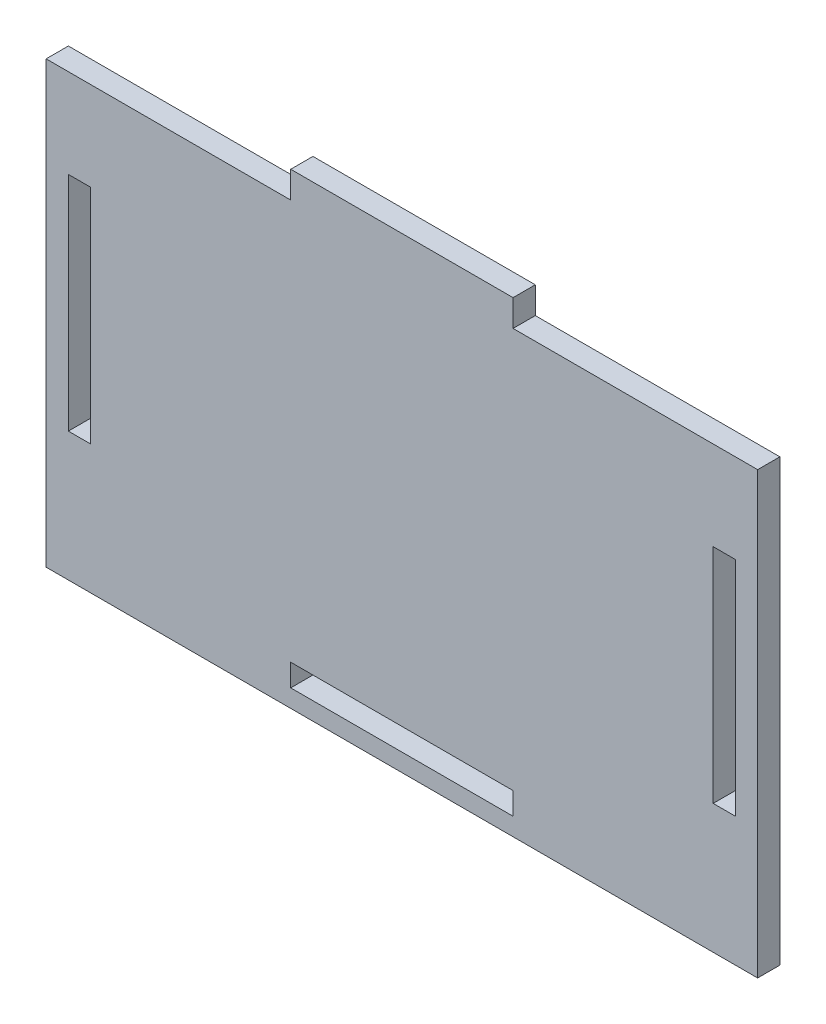
ISO-10303-21;
HEADER;
FILE_DESCRIPTION(('STEP AP214'),'2;1');
FILE_NAME('part.step','',(''),(''),'','','');
FILE_SCHEMA(('AUTOMOTIVE_DESIGN { 1 0 10303 214 1 1 1 1 }'));
ENDSEC;
DATA;
#1=APPLICATION_CONTEXT('core data for automotive mechanical design processes');
#2=APPLICATION_PROTOCOL_DEFINITION('international standard','automotive_design',2000,#1);
#3=PRODUCT_CONTEXT('',#1,'mechanical');
#4=PRODUCT('Part','Part','',(#3));
#5=PRODUCT_RELATED_PRODUCT_CATEGORY('part','',(#4));
#6=PRODUCT_DEFINITION_FORMATION('','',#4);
#7=PRODUCT_DEFINITION_CONTEXT('part definition',#1,'design');
#8=PRODUCT_DEFINITION('design','',#6,#7);
#9=PRODUCT_DEFINITION_SHAPE('','',#8);
#10=(LENGTH_UNIT() NAMED_UNIT(*) SI_UNIT(.MILLI.,.METRE.));
#11=(NAMED_UNIT(*) PLANE_ANGLE_UNIT() SI_UNIT($,.RADIAN.));
#12=(NAMED_UNIT(*) SI_UNIT($,.STERADIAN.) SOLID_ANGLE_UNIT());
#13=UNCERTAINTY_MEASURE_WITH_UNIT(LENGTH_MEASURE(1.E-05),#10,'distance_accuracy_value','');
#14=(GEOMETRIC_REPRESENTATION_CONTEXT(3) GLOBAL_UNCERTAINTY_ASSIGNED_CONTEXT((#13)) GLOBAL_UNIT_ASSIGNED_CONTEXT((#10,
#11,#12)) REPRESENTATION_CONTEXT('',''));
#15=CARTESIAN_POINT('',(0.,0.,0.));
#16=DIRECTION('',(0.,0.,1.));
#17=DIRECTION('',(1.,0.,0.));
#18=AXIS2_PLACEMENT_3D('',#15,#16,#17);
#19=CARTESIAN_POINT('',(0.,0.,3.175));
#20=DIRECTION('',(0.,0.,1.));
#21=DIRECTION('',(1.,0.,0.));
#22=AXIS2_PLACEMENT_3D('',#19,#20,#21);
#23=PLANE('',#22);
#24=DIRECTION('',(1.,0.,0.));
#25=VECTOR('',#24,1.);
#26=CARTESIAN_POINT('',(-47.625,-15.875,3.175));
#27=LINE('',#26,#25);
#28=CARTESIAN_POINT('',(-47.625,-15.875,3.175));
#29=VERTEX_POINT('',#28);
#30=CARTESIAN_POINT('',(-44.45,-15.875,3.175));
#31=VERTEX_POINT('',#30);
#32=EDGE_CURVE('E208',#29,#31,#27,.T.);
#33=ORIENTED_EDGE('',*,*,#32,.F.);
#34=DIRECTION('',(0.,-1.,0.));
#35=VECTOR('',#34,1.);
#36=CARTESIAN_POINT('',(-47.625,15.875,3.175));
#37=LINE('',#36,#35);
#38=CARTESIAN_POINT('',(-47.625,15.875,3.175));
#39=VERTEX_POINT('',#38);
#40=EDGE_CURVE('E206',#39,#29,#37,.T.);
#41=ORIENTED_EDGE('',*,*,#40,.F.);
#42=DIRECTION('',(-1.,0.,0.));
#43=VECTOR('',#42,1.);
#44=CARTESIAN_POINT('',(-47.625,15.875,3.175));
#45=LINE('',#44,#43);
#46=CARTESIAN_POINT('',(-44.45,15.875,3.175));
#47=VERTEX_POINT('',#46);
#48=EDGE_CURVE('E214',#47,#39,#45,.T.);
#49=ORIENTED_EDGE('',*,*,#48,.F.);
#50=DIRECTION('',(0.,1.,0.));
#51=VECTOR('',#50,1.);
#52=CARTESIAN_POINT('',(-44.45,15.875,3.175));
#53=LINE('',#52,#51);
#54=EDGE_CURVE('E211',#31,#47,#53,.T.);
#55=ORIENTED_EDGE('',*,*,#54,.F.);
#56=EDGE_LOOP('',(#33,#41,#49,#55));
#57=FACE_BOUND('',#56,.T.);
#58=DIRECTION('',(0.,-1.,0.));
#59=VECTOR('',#58,1.);
#60=CARTESIAN_POINT('',(-50.8,28.575,3.175));
#61=LINE('',#60,#59);
#62=CARTESIAN_POINT('',(-50.8,28.575,3.175));
#63=VERTEX_POINT('',#62);
#64=CARTESIAN_POINT('',(-50.8,-34.29,3.175));
#65=VERTEX_POINT('',#64);
#66=EDGE_CURVE('E268',#63,#65,#61,.T.);
#67=ORIENTED_EDGE('',*,*,#66,.T.);
#68=DIRECTION('',(1.,0.,0.));
#69=VECTOR('',#68,1.);
#70=CARTESIAN_POINT('',(-50.8,-34.29,3.175));
#71=LINE('',#70,#69);
#72=CARTESIAN_POINT('',(50.8,-34.29,3.175));
#73=VERTEX_POINT('',#72);
#74=EDGE_CURVE('E271',#65,#73,#71,.T.);
#75=ORIENTED_EDGE('',*,*,#74,.T.);
#76=DIRECTION('',(0.,1.,0.));
#77=VECTOR('',#76,1.);
#78=CARTESIAN_POINT('',(50.8,28.575,3.175));
#79=LINE('',#78,#77);
#80=CARTESIAN_POINT('',(50.8,28.575,3.175));
#81=VERTEX_POINT('',#80);
#82=EDGE_CURVE('E274',#73,#81,#79,.T.);
#83=ORIENTED_EDGE('',*,*,#82,.T.);
#84=DIRECTION('',(-1.,0.,0.));
#85=VECTOR('',#84,1.);
#86=CARTESIAN_POINT('',(15.875,28.575,3.175));
#87=LINE('',#86,#85);
#88=CARTESIAN_POINT('',(15.875,28.575,3.175));
#89=VERTEX_POINT('',#88);
#90=EDGE_CURVE('E276',#81,#89,#87,.T.);
#91=ORIENTED_EDGE('',*,*,#90,.T.);
#92=DIRECTION('',(0.,1.,0.));
#93=VECTOR('',#92,1.);
#94=CARTESIAN_POINT('',(15.875,28.575,3.175));
#95=LINE('',#94,#93);
#96=CARTESIAN_POINT('',(15.875,32.385,3.175));
#97=VERTEX_POINT('',#96);
#98=EDGE_CURVE('E278',#89,#97,#95,.T.);
#99=ORIENTED_EDGE('',*,*,#98,.T.);
#100=DIRECTION('',(-1.,0.,0.));
#101=VECTOR('',#100,1.);
#102=CARTESIAN_POINT('',(-15.875,32.385,3.175));
#103=LINE('',#102,#101);
#104=CARTESIAN_POINT('',(-15.875,32.385,3.175));
#105=VERTEX_POINT('',#104);
#106=EDGE_CURVE('E280',#97,#105,#103,.T.);
#107=ORIENTED_EDGE('',*,*,#106,.T.);
#108=DIRECTION('',(0.,-1.,0.));
#109=VECTOR('',#108,1.);
#110=CARTESIAN_POINT('',(-15.875,28.575,3.175));
#111=LINE('',#110,#109);
#112=CARTESIAN_POINT('',(-15.875,28.575,3.175));
#113=VERTEX_POINT('',#112);
#114=EDGE_CURVE('E282',#105,#113,#111,.T.);
#115=ORIENTED_EDGE('',*,*,#114,.T.);
#116=DIRECTION('',(-1.,0.,0.));
#117=VECTOR('',#116,1.);
#118=CARTESIAN_POINT('',(-50.8,28.575,3.175));
#119=LINE('',#118,#117);
#120=EDGE_CURVE('E284',#113,#63,#119,.T.);
#121=ORIENTED_EDGE('',*,*,#120,.T.);
#122=EDGE_LOOP('',(#67,#75,#83,#91,#99,#107,#115,#121));
#123=FACE_BOUND('',#122,.T.);
#124=DIRECTION('',(1.,0.,0.));
#125=VECTOR('',#124,1.);
#126=CARTESIAN_POINT('',(-15.875,-31.75,3.175));
#127=LINE('',#126,#125);
#128=CARTESIAN_POINT('',(-15.875,-31.75,3.175));
#129=VERTEX_POINT('',#128);
#130=CARTESIAN_POINT('',(15.875,-31.75,3.175));
#131=VERTEX_POINT('',#130);
#132=EDGE_CURVE('E239',#129,#131,#127,.T.);
#133=ORIENTED_EDGE('',*,*,#132,.F.);
#134=DIRECTION('',(0.,-1.,0.));
#135=VECTOR('',#134,1.);
#136=CARTESIAN_POINT('',(-15.875,-28.575,3.175));
#137=LINE('',#136,#135);
#138=CARTESIAN_POINT('',(-15.875,-28.575,3.175));
#139=VERTEX_POINT('',#138);
#140=EDGE_CURVE('E237',#139,#129,#137,.T.);
#141=ORIENTED_EDGE('',*,*,#140,.F.);
#142=DIRECTION('',(-1.,0.,0.));
#143=VECTOR('',#142,1.);
#144=CARTESIAN_POINT('',(-15.875,-28.575,3.175));
#145=LINE('',#144,#143);
#146=CARTESIAN_POINT('',(15.875,-28.575,3.175));
#147=VERTEX_POINT('',#146);
#148=EDGE_CURVE('E245',#147,#139,#145,.T.);
#149=ORIENTED_EDGE('',*,*,#148,.F.);
#150=DIRECTION('',(0.,1.,0.));
#151=VECTOR('',#150,1.);
#152=CARTESIAN_POINT('',(15.875,-28.575,3.175));
#153=LINE('',#152,#151);
#154=EDGE_CURVE('E242',#131,#147,#153,.T.);
#155=ORIENTED_EDGE('',*,*,#154,.F.);
#156=EDGE_LOOP('',(#133,#141,#149,#155));
#157=FACE_BOUND('',#156,.T.);
#158=DIRECTION('',(1.,0.,0.));
#159=VECTOR('',#158,1.);
#160=CARTESIAN_POINT('',(44.45,-15.875,3.175));
#161=LINE('',#160,#159);
#162=CARTESIAN_POINT('',(44.45,-15.875,3.175));
#163=VERTEX_POINT('',#162);
#164=CARTESIAN_POINT('',(47.625,-15.875,3.175));
#165=VERTEX_POINT('',#164);
#166=EDGE_CURVE('E178',#163,#165,#161,.T.);
#167=ORIENTED_EDGE('',*,*,#166,.F.);
#168=DIRECTION('',(0.,-1.,0.));
#169=VECTOR('',#168,1.);
#170=CARTESIAN_POINT('',(44.45,15.875,3.175));
#171=LINE('',#170,#169);
#172=CARTESIAN_POINT('',(44.45,15.875,3.175));
#173=VERTEX_POINT('',#172);
#174=EDGE_CURVE('E170',#173,#163,#171,.T.);
#175=ORIENTED_EDGE('',*,*,#174,.F.);
#176=DIRECTION('',(-1.,0.,0.));
#177=VECTOR('',#176,1.);
#178=CARTESIAN_POINT('',(44.45,15.875,3.175));
#179=LINE('',#178,#177);
#180=CARTESIAN_POINT('',(47.625,15.875,3.175));
#181=VERTEX_POINT('',#180);
#182=EDGE_CURVE('E192',#181,#173,#179,.T.);
#183=ORIENTED_EDGE('',*,*,#182,.F.);
#184=DIRECTION('',(0.,1.,0.));
#185=VECTOR('',#184,1.);
#186=CARTESIAN_POINT('',(47.625,15.875,3.175));
#187=LINE('',#186,#185);
#188=EDGE_CURVE('E190',#165,#181,#187,.T.);
#189=ORIENTED_EDGE('',*,*,#188,.F.);
#190=EDGE_LOOP('',(#167,#175,#183,#189));
#191=FACE_BOUND('',#190,.T.);
#192=ADVANCED_FACE('F33',(#57,#123,#157,#191),#23,.T.);
#193=CARTESIAN_POINT('',(0.,0.,0.));
#194=DIRECTION('',(0.,0.,1.));
#195=DIRECTION('',(1.,0.,0.));
#196=AXIS2_PLACEMENT_3D('',#193,#194,#195);
#197=PLANE('',#196);
#198=DIRECTION('',(0.,-1.,0.));
#199=VECTOR('',#198,1.);
#200=CARTESIAN_POINT('',(-47.625,15.875,0.));
#201=LINE('',#200,#199);
#202=CARTESIAN_POINT('',(-47.625,15.875,0.));
#203=VERTEX_POINT('',#202);
#204=CARTESIAN_POINT('',(-47.625,-15.875,0.));
#205=VERTEX_POINT('',#204);
#206=EDGE_CURVE('E186',#203,#205,#201,.T.);
#207=ORIENTED_EDGE('',*,*,#206,.T.);
#208=DIRECTION('',(1.,0.,0.));
#209=VECTOR('',#208,1.);
#210=CARTESIAN_POINT('',(-47.625,-15.875,0.));
#211=LINE('',#210,#209);
#212=CARTESIAN_POINT('',(-44.45,-15.875,0.));
#213=VERTEX_POINT('',#212);
#214=EDGE_CURVE('E219',#205,#213,#211,.T.);
#215=ORIENTED_EDGE('',*,*,#214,.T.);
#216=DIRECTION('',(0.,1.,0.));
#217=VECTOR('',#216,1.);
#218=CARTESIAN_POINT('',(-44.45,15.875,0.));
#219=LINE('',#218,#217);
#220=CARTESIAN_POINT('',(-44.45,15.875,0.));
#221=VERTEX_POINT('',#220);
#222=EDGE_CURVE('E222',#213,#221,#219,.T.);
#223=ORIENTED_EDGE('',*,*,#222,.T.);
#224=DIRECTION('',(-1.,0.,0.));
#225=VECTOR('',#224,1.);
#226=CARTESIAN_POINT('',(-47.625,15.875,0.));
#227=LINE('',#226,#225);
#228=EDGE_CURVE('E209',#221,#203,#227,.T.);
#229=ORIENTED_EDGE('',*,*,#228,.T.);
#230=EDGE_LOOP('',(#207,#215,#223,#229));
#231=FACE_BOUND('',#230,.T.);
#232=DIRECTION('',(0.,-1.,0.));
#233=VECTOR('',#232,1.);
#234=CARTESIAN_POINT('',(-50.8,28.575,0.));
#235=LINE('',#234,#233);
#236=CARTESIAN_POINT('',(-50.8,28.575,0.));
#237=VERTEX_POINT('',#236);
#238=CARTESIAN_POINT('',(-50.8,-34.29,0.));
#239=VERTEX_POINT('',#238);
#240=EDGE_CURVE('E267',#237,#239,#235,.T.);
#241=ORIENTED_EDGE('',*,*,#240,.F.);
#242=DIRECTION('',(-1.,0.,0.));
#243=VECTOR('',#242,1.);
#244=CARTESIAN_POINT('',(-50.8,28.575,0.));
#245=LINE('',#244,#243);
#246=CARTESIAN_POINT('',(-15.875,28.575,0.));
#247=VERTEX_POINT('',#246);
#248=EDGE_CURVE('E272',#247,#237,#245,.T.);
#249=ORIENTED_EDGE('',*,*,#248,.F.);
#250=DIRECTION('',(0.,-1.,0.));
#251=VECTOR('',#250,1.);
#252=CARTESIAN_POINT('',(-15.875,28.575,0.));
#253=LINE('',#252,#251);
#254=CARTESIAN_POINT('',(-15.875,32.385,0.));
#255=VERTEX_POINT('',#254);
#256=EDGE_CURVE('E299',#255,#247,#253,.T.);
#257=ORIENTED_EDGE('',*,*,#256,.F.);
#258=DIRECTION('',(-1.,0.,0.));
#259=VECTOR('',#258,1.);
#260=CARTESIAN_POINT('',(-15.875,32.385,0.));
#261=LINE('',#260,#259);
#262=CARTESIAN_POINT('',(15.875,32.385,0.));
#263=VERTEX_POINT('',#262);
#264=EDGE_CURVE('E297',#263,#255,#261,.T.);
#265=ORIENTED_EDGE('',*,*,#264,.F.);
#266=DIRECTION('',(0.,1.,0.));
#267=VECTOR('',#266,1.);
#268=CARTESIAN_POINT('',(15.875,28.575,0.));
#269=LINE('',#268,#267);
#270=CARTESIAN_POINT('',(15.875,28.575,0.));
#271=VERTEX_POINT('',#270);
#272=EDGE_CURVE('E295',#271,#263,#269,.T.);
#273=ORIENTED_EDGE('',*,*,#272,.F.);
#274=DIRECTION('',(-1.,0.,0.));
#275=VECTOR('',#274,1.);
#276=CARTESIAN_POINT('',(15.875,28.575,0.));
#277=LINE('',#276,#275);
#278=CARTESIAN_POINT('',(50.8,28.575,0.));
#279=VERTEX_POINT('',#278);
#280=EDGE_CURVE('E293',#279,#271,#277,.T.);
#281=ORIENTED_EDGE('',*,*,#280,.F.);
#282=DIRECTION('',(0.,1.,0.));
#283=VECTOR('',#282,1.);
#284=CARTESIAN_POINT('',(50.8,28.575,0.));
#285=LINE('',#284,#283);
#286=CARTESIAN_POINT('',(50.8,-34.29,0.));
#287=VERTEX_POINT('',#286);
#288=EDGE_CURVE('E291',#287,#279,#285,.T.);
#289=ORIENTED_EDGE('',*,*,#288,.F.);
#290=DIRECTION('',(1.,0.,0.));
#291=VECTOR('',#290,1.);
#292=CARTESIAN_POINT('',(-50.8,-34.29,0.));
#293=LINE('',#292,#291);
#294=EDGE_CURVE('E289',#239,#287,#293,.T.);
#295=ORIENTED_EDGE('',*,*,#294,.F.);
#296=EDGE_LOOP('',(#241,#249,#257,#265,#273,#281,#289,#295));
#297=FACE_BOUND('',#296,.T.);
#298=DIRECTION('',(0.,-1.,0.));
#299=VECTOR('',#298,1.);
#300=CARTESIAN_POINT('',(-15.875,-28.575,0.));
#301=LINE('',#300,#299);
#302=CARTESIAN_POINT('',(-15.875,-28.575,0.));
#303=VERTEX_POINT('',#302);
#304=CARTESIAN_POINT('',(-15.875,-31.75,0.));
#305=VERTEX_POINT('',#304);
#306=EDGE_CURVE('E236',#303,#305,#301,.T.);
#307=ORIENTED_EDGE('',*,*,#306,.T.);
#308=DIRECTION('',(1.,0.,0.));
#309=VECTOR('',#308,1.);
#310=CARTESIAN_POINT('',(-15.875,-31.75,0.));
#311=LINE('',#310,#309);
#312=CARTESIAN_POINT('',(15.875,-31.75,0.));
#313=VERTEX_POINT('',#312);
#314=EDGE_CURVE('E250',#305,#313,#311,.T.);
#315=ORIENTED_EDGE('',*,*,#314,.T.);
#316=DIRECTION('',(0.,1.,0.));
#317=VECTOR('',#316,1.);
#318=CARTESIAN_POINT('',(15.875,-28.575,0.));
#319=LINE('',#318,#317);
#320=CARTESIAN_POINT('',(15.875,-28.575,0.));
#321=VERTEX_POINT('',#320);
#322=EDGE_CURVE('E253',#313,#321,#319,.T.);
#323=ORIENTED_EDGE('',*,*,#322,.T.);
#324=DIRECTION('',(-1.,0.,0.));
#325=VECTOR('',#324,1.);
#326=CARTESIAN_POINT('',(-15.875,-28.575,0.));
#327=LINE('',#326,#325);
#328=EDGE_CURVE('E240',#321,#303,#327,.T.);
#329=ORIENTED_EDGE('',*,*,#328,.T.);
#330=EDGE_LOOP('',(#307,#315,#323,#329));
#331=FACE_BOUND('',#330,.T.);
#332=DIRECTION('',(0.,-1.,0.));
#333=VECTOR('',#332,1.);
#334=CARTESIAN_POINT('',(44.45,15.875,0.));
#335=LINE('',#334,#333);
#336=CARTESIAN_POINT('',(44.45,15.875,0.));
#337=VERTEX_POINT('',#336);
#338=CARTESIAN_POINT('',(44.45,-15.875,0.));
#339=VERTEX_POINT('',#338);
#340=EDGE_CURVE('E56',#337,#339,#335,.T.);
#341=ORIENTED_EDGE('',*,*,#340,.T.);
#342=DIRECTION('',(1.,0.,0.));
#343=VECTOR('',#342,1.);
#344=CARTESIAN_POINT('',(44.45,-15.875,0.));
#345=LINE('',#344,#343);
#346=CARTESIAN_POINT('',(47.625,-15.875,0.));
#347=VERTEX_POINT('',#346);
#348=EDGE_CURVE('E185',#339,#347,#345,.T.);
#349=ORIENTED_EDGE('',*,*,#348,.T.);
#350=DIRECTION('',(0.,1.,0.));
#351=VECTOR('',#350,1.);
#352=CARTESIAN_POINT('',(47.625,15.875,0.));
#353=LINE('',#352,#351);
#354=CARTESIAN_POINT('',(47.625,15.875,0.));
#355=VERTEX_POINT('',#354);
#356=EDGE_CURVE('E198',#347,#355,#353,.T.);
#357=ORIENTED_EDGE('',*,*,#356,.T.);
#358=DIRECTION('',(-1.,0.,0.));
#359=VECTOR('',#358,1.);
#360=CARTESIAN_POINT('',(44.45,15.875,0.));
#361=LINE('',#360,#359);
#362=EDGE_CURVE('E179',#355,#337,#361,.T.);
#363=ORIENTED_EDGE('',*,*,#362,.T.);
#364=EDGE_LOOP('',(#341,#349,#357,#363));
#365=FACE_BOUND('',#364,.T.);
#366=ADVANCED_FACE('F329',(#231,#297,#331,#365),#197,.F.);
#367=CARTESIAN_POINT('',(-50.8,28.575,3.175));
#368=DIRECTION('',(1.,0.,0.));
#369=DIRECTION('',(0.,0.,-1.));
#370=AXIS2_PLACEMENT_3D('',#367,#368,#369);
#371=PLANE('',#370);
#372=ORIENTED_EDGE('',*,*,#240,.T.);
#373=DIRECTION('',(0.,0.,-1.));
#374=VECTOR('',#373,1.);
#375=CARTESIAN_POINT('',(-50.8,-34.29,3.175));
#376=LINE('',#375,#374);
#377=EDGE_CURVE('E11',#65,#239,#376,.T.);
#378=ORIENTED_EDGE('',*,*,#377,.F.);
#379=ORIENTED_EDGE('',*,*,#66,.F.);
#380=DIRECTION('',(0.,0.,-1.));
#381=VECTOR('',#380,1.);
#382=CARTESIAN_POINT('',(-50.8,28.575,3.175));
#383=LINE('',#382,#381);
#384=EDGE_CURVE('E286',#63,#237,#383,.T.);
#385=ORIENTED_EDGE('',*,*,#384,.T.);
#386=EDGE_LOOP('',(#372,#378,#379,#385));
#387=FACE_BOUND('',#386,.T.);
#388=ADVANCED_FACE('F35',(#387),#371,.F.);
#389=CARTESIAN_POINT('',(-50.8,-34.29,3.175));
#390=DIRECTION('',(0.,1.,0.));
#391=DIRECTION('',(-1.,0.,0.));
#392=AXIS2_PLACEMENT_3D('',#389,#390,#391);
#393=PLANE('',#392);
#394=ORIENTED_EDGE('',*,*,#294,.T.);
#395=DIRECTION('',(0.,0.,-1.));
#396=VECTOR('',#395,1.);
#397=CARTESIAN_POINT('',(50.8,-34.29,3.175));
#398=LINE('',#397,#396);
#399=EDGE_CURVE('E41',#73,#287,#398,.T.);
#400=ORIENTED_EDGE('',*,*,#399,.F.);
#401=ORIENTED_EDGE('',*,*,#74,.F.);
#402=ORIENTED_EDGE('',*,*,#377,.T.);
#403=EDGE_LOOP('',(#394,#400,#401,#402));
#404=FACE_BOUND('',#403,.T.);
#405=ADVANCED_FACE('F347',(#404),#393,.F.);
#406=CARTESIAN_POINT('',(50.8,28.575,3.175));
#407=DIRECTION('',(-1.,0.,0.));
#408=DIRECTION('',(0.,0.,1.));
#409=AXIS2_PLACEMENT_3D('',#406,#407,#408);
#410=PLANE('',#409);
#411=ORIENTED_EDGE('',*,*,#288,.T.);
#412=DIRECTION('',(0.,0.,-1.));
#413=VECTOR('',#412,1.);
#414=CARTESIAN_POINT('',(50.8,28.575,3.175));
#415=LINE('',#414,#413);
#416=EDGE_CURVE('E316',#81,#279,#415,.T.);
#417=ORIENTED_EDGE('',*,*,#416,.F.);
#418=ORIENTED_EDGE('',*,*,#82,.F.);
#419=ORIENTED_EDGE('',*,*,#399,.T.);
#420=EDGE_LOOP('',(#411,#417,#418,#419));
#421=FACE_BOUND('',#420,.T.);
#422=ADVANCED_FACE('F323',(#421),#410,.F.);
#423=CARTESIAN_POINT('',(15.875,28.575,3.175));
#424=DIRECTION('',(0.,-1.,0.));
#425=DIRECTION('',(1.,0.,0.));
#426=AXIS2_PLACEMENT_3D('',#423,#424,#425);
#427=PLANE('',#426);
#428=ORIENTED_EDGE('',*,*,#280,.T.);
#429=DIRECTION('',(0.,0.,-1.));
#430=VECTOR('',#429,1.);
#431=CARTESIAN_POINT('',(15.875,28.575,3.175));
#432=LINE('',#431,#430);
#433=EDGE_CURVE('E313',#89,#271,#432,.T.);
#434=ORIENTED_EDGE('',*,*,#433,.F.);
#435=ORIENTED_EDGE('',*,*,#90,.F.);
#436=ORIENTED_EDGE('',*,*,#416,.T.);
#437=EDGE_LOOP('',(#428,#434,#435,#436));
#438=FACE_BOUND('',#437,.T.);
#439=ADVANCED_FACE('F335',(#438),#427,.F.);
#440=CARTESIAN_POINT('',(15.875,28.575,3.175));
#441=DIRECTION('',(-1.,0.,0.));
#442=DIRECTION('',(0.,-1.,0.));
#443=AXIS2_PLACEMENT_3D('',#440,#441,#442);
#444=PLANE('',#443);
#445=ORIENTED_EDGE('',*,*,#272,.T.);
#446=DIRECTION('',(0.,0.,-1.));
#447=VECTOR('',#446,1.);
#448=CARTESIAN_POINT('',(15.875,32.385,3.175));
#449=LINE('',#448,#447);
#450=EDGE_CURVE('E310',#97,#263,#449,.T.);
#451=ORIENTED_EDGE('',*,*,#450,.F.);
#452=ORIENTED_EDGE('',*,*,#98,.F.);
#453=ORIENTED_EDGE('',*,*,#433,.T.);
#454=EDGE_LOOP('',(#445,#451,#452,#453));
#455=FACE_BOUND('',#454,.T.);
#456=ADVANCED_FACE('F339',(#455),#444,.F.);
#457=CARTESIAN_POINT('',(-15.875,32.385,3.175));
#458=DIRECTION('',(0.,-1.,0.));
#459=DIRECTION('',(1.,0.,0.));
#460=AXIS2_PLACEMENT_3D('',#457,#458,#459);
#461=PLANE('',#460);
#462=ORIENTED_EDGE('',*,*,#264,.T.);
#463=DIRECTION('',(0.,0.,-1.));
#464=VECTOR('',#463,1.);
#465=CARTESIAN_POINT('',(-15.875,32.385,3.175));
#466=LINE('',#465,#464);
#467=EDGE_CURVE('E307',#105,#255,#466,.T.);
#468=ORIENTED_EDGE('',*,*,#467,.F.);
#469=ORIENTED_EDGE('',*,*,#106,.F.);
#470=ORIENTED_EDGE('',*,*,#450,.T.);
#471=EDGE_LOOP('',(#462,#468,#469,#470));
#472=FACE_BOUND('',#471,.T.);
#473=ADVANCED_FACE('F360',(#472),#461,.F.);
#474=CARTESIAN_POINT('',(-15.875,28.575,3.175));
#475=DIRECTION('',(1.,0.,0.));
#476=DIRECTION('',(0.,0.,-1.));
#477=AXIS2_PLACEMENT_3D('',#474,#475,#476);
#478=PLANE('',#477);
#479=ORIENTED_EDGE('',*,*,#256,.T.);
#480=DIRECTION('',(0.,0.,-1.));
#481=VECTOR('',#480,1.);
#482=CARTESIAN_POINT('',(-15.875,28.575,3.175));
#483=LINE('',#482,#481);
#484=EDGE_CURVE('E304',#113,#247,#483,.T.);
#485=ORIENTED_EDGE('',*,*,#484,.F.);
#486=ORIENTED_EDGE('',*,*,#114,.F.);
#487=ORIENTED_EDGE('',*,*,#467,.T.);
#488=EDGE_LOOP('',(#479,#485,#486,#487));
#489=FACE_BOUND('',#488,.T.);
#490=ADVANCED_FACE('F358',(#489),#478,.F.);
#491=CARTESIAN_POINT('',(-50.8,28.575,3.175));
#492=DIRECTION('',(0.,-1.,0.));
#493=DIRECTION('',(1.,0.,0.));
#494=AXIS2_PLACEMENT_3D('',#491,#492,#493);
#495=PLANE('',#494);
#496=ORIENTED_EDGE('',*,*,#248,.T.);
#497=ORIENTED_EDGE('',*,*,#384,.F.);
#498=ORIENTED_EDGE('',*,*,#120,.F.);
#499=ORIENTED_EDGE('',*,*,#484,.T.);
#500=EDGE_LOOP('',(#496,#497,#498,#499));
#501=FACE_BOUND('',#500,.T.);
#502=ADVANCED_FACE('F353',(#501),#495,.F.);
#503=CARTESIAN_POINT('',(-15.875,-28.575,3.175));
#504=DIRECTION('',(1.,0.,0.));
#505=DIRECTION('',(0.,0.,-1.));
#506=AXIS2_PLACEMENT_3D('',#503,#504,#505);
#507=PLANE('',#506);
#508=ORIENTED_EDGE('',*,*,#306,.F.);
#509=DIRECTION('',(0.,0.,-1.));
#510=VECTOR('',#509,1.);
#511=CARTESIAN_POINT('',(-15.875,-28.575,3.175));
#512=LINE('',#511,#510);
#513=EDGE_CURVE('E247',#139,#303,#512,.T.);
#514=ORIENTED_EDGE('',*,*,#513,.F.);
#515=ORIENTED_EDGE('',*,*,#140,.T.);
#516=DIRECTION('',(0.,0.,-1.));
#517=VECTOR('',#516,1.);
#518=CARTESIAN_POINT('',(-15.875,-31.75,3.175));
#519=LINE('',#518,#517);
#520=EDGE_CURVE('E264',#129,#305,#519,.T.);
#521=ORIENTED_EDGE('',*,*,#520,.T.);
#522=EDGE_LOOP('',(#508,#514,#515,#521));
#523=FACE_BOUND('',#522,.T.);
#524=ADVANCED_FACE('F379',(#523),#507,.T.);
#525=CARTESIAN_POINT('',(-15.875,-31.75,3.175));
#526=DIRECTION('',(0.,1.,0.));
#527=DIRECTION('',(-1.,0.,0.));
#528=AXIS2_PLACEMENT_3D('',#525,#526,#527);
#529=PLANE('',#528);
#530=ORIENTED_EDGE('',*,*,#314,.F.);
#531=ORIENTED_EDGE('',*,*,#520,.F.);
#532=ORIENTED_EDGE('',*,*,#132,.T.);
#533=DIRECTION('',(0.,0.,-1.));
#534=VECTOR('',#533,1.);
#535=CARTESIAN_POINT('',(15.875,-31.75,3.175));
#536=LINE('',#535,#534);
#537=EDGE_CURVE('E262',#131,#313,#536,.T.);
#538=ORIENTED_EDGE('',*,*,#537,.T.);
#539=EDGE_LOOP('',(#530,#531,#532,#538));
#540=FACE_BOUND('',#539,.T.);
#541=ADVANCED_FACE('F386',(#540),#529,.T.);
#542=CARTESIAN_POINT('',(15.875,-28.575,3.175));
#543=DIRECTION('',(-1.,0.,0.));
#544=DIRECTION('',(0.,0.,1.));
#545=AXIS2_PLACEMENT_3D('',#542,#543,#544);
#546=PLANE('',#545);
#547=ORIENTED_EDGE('',*,*,#322,.F.);
#548=ORIENTED_EDGE('',*,*,#537,.F.);
#549=ORIENTED_EDGE('',*,*,#154,.T.);
#550=DIRECTION('',(0.,0.,-1.));
#551=VECTOR('',#550,1.);
#552=CARTESIAN_POINT('',(15.875,-28.575,3.175));
#553=LINE('',#552,#551);
#554=EDGE_CURVE('E260',#147,#321,#553,.T.);
#555=ORIENTED_EDGE('',*,*,#554,.T.);
#556=EDGE_LOOP('',(#547,#548,#549,#555));
#557=FACE_BOUND('',#556,.T.);
#558=ADVANCED_FACE('F391',(#557),#546,.T.);
#559=CARTESIAN_POINT('',(-15.875,-28.575,3.175));
#560=DIRECTION('',(0.,-1.,0.));
#561=DIRECTION('',(1.,0.,0.));
#562=AXIS2_PLACEMENT_3D('',#559,#560,#561);
#563=PLANE('',#562);
#564=ORIENTED_EDGE('',*,*,#328,.F.);
#565=ORIENTED_EDGE('',*,*,#554,.F.);
#566=ORIENTED_EDGE('',*,*,#148,.T.);
#567=ORIENTED_EDGE('',*,*,#513,.T.);
#568=EDGE_LOOP('',(#564,#565,#566,#567));
#569=FACE_BOUND('',#568,.T.);
#570=ADVANCED_FACE('F398',(#569),#563,.T.);
#571=CARTESIAN_POINT('',(-47.625,15.875,3.175));
#572=DIRECTION('',(1.,0.,0.));
#573=DIRECTION('',(0.,0.,-1.));
#574=AXIS2_PLACEMENT_3D('',#571,#572,#573);
#575=PLANE('',#574);
#576=ORIENTED_EDGE('',*,*,#206,.F.);
#577=DIRECTION('',(0.,0.,-1.));
#578=VECTOR('',#577,1.);
#579=CARTESIAN_POINT('',(-47.625,15.875,3.175));
#580=LINE('',#579,#578);
#581=EDGE_CURVE('E216',#39,#203,#580,.T.);
#582=ORIENTED_EDGE('',*,*,#581,.F.);
#583=ORIENTED_EDGE('',*,*,#40,.T.);
#584=DIRECTION('',(0.,0.,-1.));
#585=VECTOR('',#584,1.);
#586=CARTESIAN_POINT('',(-47.625,-15.875,3.175));
#587=LINE('',#586,#585);
#588=EDGE_CURVE('E233',#29,#205,#587,.T.);
#589=ORIENTED_EDGE('',*,*,#588,.T.);
#590=EDGE_LOOP('',(#576,#582,#583,#589));
#591=FACE_BOUND('',#590,.T.);
#592=ADVANCED_FACE('F411',(#591),#575,.T.);
#593=CARTESIAN_POINT('',(-47.625,-15.875,3.175));
#594=DIRECTION('',(0.,1.,0.));
#595=DIRECTION('',(0.,0.,1.));
#596=AXIS2_PLACEMENT_3D('',#593,#594,#595);
#597=PLANE('',#596);
#598=ORIENTED_EDGE('',*,*,#214,.F.);
#599=ORIENTED_EDGE('',*,*,#588,.F.);
#600=ORIENTED_EDGE('',*,*,#32,.T.);
#601=DIRECTION('',(0.,0.,-1.));
#602=VECTOR('',#601,1.);
#603=CARTESIAN_POINT('',(-44.45,-15.875,3.175));
#604=LINE('',#603,#602);
#605=EDGE_CURVE('E231',#31,#213,#604,.T.);
#606=ORIENTED_EDGE('',*,*,#605,.T.);
#607=EDGE_LOOP('',(#598,#599,#600,#606));
#608=FACE_BOUND('',#607,.T.);
#609=ADVANCED_FACE('F416',(#608),#597,.T.);
#610=CARTESIAN_POINT('',(-44.45,15.875,3.175));
#611=DIRECTION('',(-1.,0.,0.));
#612=DIRECTION('',(0.,-1.,0.));
#613=AXIS2_PLACEMENT_3D('',#610,#611,#612);
#614=PLANE('',#613);
#615=ORIENTED_EDGE('',*,*,#222,.F.);
#616=ORIENTED_EDGE('',*,*,#605,.F.);
#617=ORIENTED_EDGE('',*,*,#54,.T.);
#618=DIRECTION('',(0.,0.,-1.));
#619=VECTOR('',#618,1.);
#620=CARTESIAN_POINT('',(-44.45,15.875,3.175));
#621=LINE('',#620,#619);
#622=EDGE_CURVE('E229',#47,#221,#621,.T.);
#623=ORIENTED_EDGE('',*,*,#622,.T.);
#624=EDGE_LOOP('',(#615,#616,#617,#623));
#625=FACE_BOUND('',#624,.T.);
#626=ADVANCED_FACE('F420',(#625),#614,.T.);
#627=CARTESIAN_POINT('',(-47.625,15.875,3.175));
#628=DIRECTION('',(0.,-1.,0.));
#629=DIRECTION('',(0.,0.,-1.));
#630=AXIS2_PLACEMENT_3D('',#627,#628,#629);
#631=PLANE('',#630);
#632=ORIENTED_EDGE('',*,*,#228,.F.);
#633=ORIENTED_EDGE('',*,*,#622,.F.);
#634=ORIENTED_EDGE('',*,*,#48,.T.);
#635=ORIENTED_EDGE('',*,*,#581,.T.);
#636=EDGE_LOOP('',(#632,#633,#634,#635));
#637=FACE_BOUND('',#636,.T.);
#638=ADVANCED_FACE('F424',(#637),#631,.T.);
#639=CARTESIAN_POINT('',(44.45,15.875,3.175));
#640=DIRECTION('',(1.,0.,0.));
#641=DIRECTION('',(0.,0.,-1.));
#642=AXIS2_PLACEMENT_3D('',#639,#640,#641);
#643=PLANE('',#642);
#644=ORIENTED_EDGE('',*,*,#340,.F.);
#645=DIRECTION('',(0.,0.,-1.));
#646=VECTOR('',#645,1.);
#647=CARTESIAN_POINT('',(44.45,15.875,3.175));
#648=LINE('',#647,#646);
#649=EDGE_CURVE('E174',#173,#337,#648,.T.);
#650=ORIENTED_EDGE('',*,*,#649,.F.);
#651=ORIENTED_EDGE('',*,*,#174,.T.);
#652=DIRECTION('',(0.,0.,-1.));
#653=VECTOR('',#652,1.);
#654=CARTESIAN_POINT('',(44.45,-15.875,3.175));
#655=LINE('',#654,#653);
#656=EDGE_CURVE('E173',#163,#339,#655,.T.);
#657=ORIENTED_EDGE('',*,*,#656,.T.);
#658=EDGE_LOOP('',(#644,#650,#651,#657));
#659=FACE_BOUND('',#658,.T.);
#660=ADVANCED_FACE('F172',(#659),#643,.T.);
#661=CARTESIAN_POINT('',(44.45,-15.875,3.175));
#662=DIRECTION('',(0.,1.,0.));
#663=DIRECTION('',(0.,0.,1.));
#664=AXIS2_PLACEMENT_3D('',#661,#662,#663);
#665=PLANE('',#664);
#666=ORIENTED_EDGE('',*,*,#348,.F.);
#667=ORIENTED_EDGE('',*,*,#656,.F.);
#668=ORIENTED_EDGE('',*,*,#166,.T.);
#669=DIRECTION('',(0.,0.,-1.));
#670=VECTOR('',#669,1.);
#671=CARTESIAN_POINT('',(47.625,-15.875,3.175));
#672=LINE('',#671,#670);
#673=EDGE_CURVE('E187',#165,#347,#672,.T.);
#674=ORIENTED_EDGE('',*,*,#673,.T.);
#675=EDGE_LOOP('',(#666,#667,#668,#674));
#676=FACE_BOUND('',#675,.T.);
#677=ADVANCED_FACE('F182',(#676),#665,.T.);
#678=CARTESIAN_POINT('',(47.625,15.875,3.175));
#679=DIRECTION('',(-1.,0.,0.));
#680=DIRECTION('',(0.,0.,1.));
#681=AXIS2_PLACEMENT_3D('',#678,#679,#680);
#682=PLANE('',#681);
#683=ORIENTED_EDGE('',*,*,#356,.F.);
#684=ORIENTED_EDGE('',*,*,#673,.F.);
#685=ORIENTED_EDGE('',*,*,#188,.T.);
#686=DIRECTION('',(0.,0.,-1.));
#687=VECTOR('',#686,1.);
#688=CARTESIAN_POINT('',(47.625,15.875,3.175));
#689=LINE('',#688,#687);
#690=EDGE_CURVE('E48',#181,#355,#689,.T.);
#691=ORIENTED_EDGE('',*,*,#690,.T.);
#692=EDGE_LOOP('',(#683,#684,#685,#691));
#693=FACE_BOUND('',#692,.T.);
#694=ADVANCED_FACE('F433',(#693),#682,.T.);
#695=CARTESIAN_POINT('',(44.45,15.875,3.175));
#696=DIRECTION('',(0.,-1.,0.));
#697=DIRECTION('',(1.,0.,0.));
#698=AXIS2_PLACEMENT_3D('',#695,#696,#697);
#699=PLANE('',#698);
#700=ORIENTED_EDGE('',*,*,#362,.F.);
#701=ORIENTED_EDGE('',*,*,#690,.F.);
#702=ORIENTED_EDGE('',*,*,#182,.T.);
#703=ORIENTED_EDGE('',*,*,#649,.T.);
#704=EDGE_LOOP('',(#700,#701,#702,#703));
#705=FACE_BOUND('',#704,.T.);
#706=ADVANCED_FACE('F436',(#705),#699,.T.);
#707=CLOSED_SHELL('',(#192,#366,#388,#405,#422,#439,#456,#473,#490,#502,#524,#541,#558,#570,
#592,#609,#626,#638,#660,#677,#694,#706));
#708=MANIFOLD_SOLID_BREP('B2',#707);
#709=ADVANCED_BREP_SHAPE_REPRESENTATION('',(#18,#708),#14);
#710=SHAPE_DEFINITION_REPRESENTATION(#9,#709);
ENDSEC;
END-ISO-10303-21;
